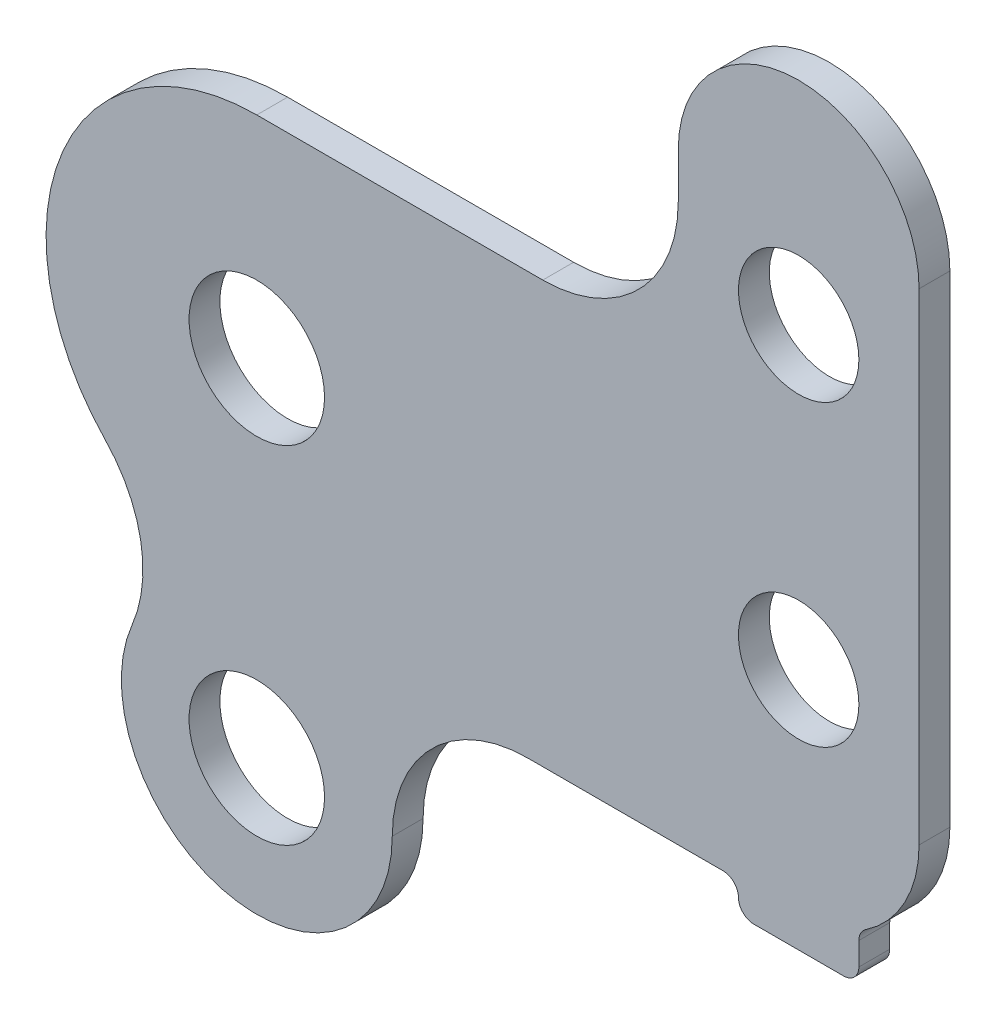
ISO-10303-21;
HEADER;
FILE_DESCRIPTION(('STEP AP214'),'2;1');
FILE_NAME('part.step','',(''),(''),'','','');
FILE_SCHEMA(('AUTOMOTIVE_DESIGN { 1 0 10303 214 1 1 1 1 }'));
ENDSEC;
DATA;
#1=APPLICATION_CONTEXT('core data for automotive mechanical design processes');
#2=APPLICATION_PROTOCOL_DEFINITION('international standard','automotive_design',2000,#1);
#3=PRODUCT_CONTEXT('',#1,'mechanical');
#4=PRODUCT('Part','Part','',(#3));
#5=PRODUCT_RELATED_PRODUCT_CATEGORY('part','',(#4));
#6=PRODUCT_DEFINITION_FORMATION('','',#4);
#7=PRODUCT_DEFINITION_CONTEXT('part definition',#1,'design');
#8=PRODUCT_DEFINITION('design','',#6,#7);
#9=PRODUCT_DEFINITION_SHAPE('','',#8);
#10=(LENGTH_UNIT() NAMED_UNIT(*) SI_UNIT(.MILLI.,.METRE.));
#11=(NAMED_UNIT(*) PLANE_ANGLE_UNIT() SI_UNIT($,.RADIAN.));
#12=(NAMED_UNIT(*) SI_UNIT($,.STERADIAN.) SOLID_ANGLE_UNIT());
#13=UNCERTAINTY_MEASURE_WITH_UNIT(LENGTH_MEASURE(1.E-05),#10,'distance_accuracy_value','');
#14=(GEOMETRIC_REPRESENTATION_CONTEXT(3) GLOBAL_UNCERTAINTY_ASSIGNED_CONTEXT((#13)) GLOBAL_UNIT_ASSIGNED_CONTEXT((#10,
#11,#12)) REPRESENTATION_CONTEXT('',''));
#15=CARTESIAN_POINT('',(0.,0.,0.));
#16=DIRECTION('',(0.,0.,1.));
#17=DIRECTION('',(1.,0.,0.));
#18=AXIS2_PLACEMENT_3D('',#15,#16,#17);
#19=CARTESIAN_POINT('',(0.,-6.36905,0.8128));
#20=DIRECTION('',(0.,1.,0.));
#21=DIRECTION('',(0.,0.,1.));
#22=AXIS2_PLACEMENT_3D('',#19,#20,#21);
#23=PLANE('',#22);
#24=DIRECTION('',(1.,0.,0.));
#25=VECTOR('',#24,1.);
#26=CARTESIAN_POINT('',(0.,-6.36905,0.));
#27=LINE('',#26,#25);
#28=CARTESIAN_POINT('',(13.1063647221787,-6.36905,0.));
#29=VERTEX_POINT('',#28);
#30=CARTESIAN_POINT('',(15.4685647221787,-6.36905,0.));
#31=VERTEX_POINT('',#30);
#32=EDGE_CURVE('E331',#29,#31,#27,.T.);
#33=ORIENTED_EDGE('',*,*,#32,.T.);
#34=DIRECTION('',(0.,0.,-1.));
#35=VECTOR('',#34,1.);
#36=CARTESIAN_POINT('',(15.4685647221787,-6.36905,0.8128));
#37=LINE('',#36,#35);
#38=CARTESIAN_POINT('',(15.4685647221787,-6.36905,0.8128));
#39=VERTEX_POINT('',#38);
#40=EDGE_CURVE('E390',#31,#39,#37,.F.);
#41=ORIENTED_EDGE('',*,*,#40,.T.);
#42=DIRECTION('',(1.,0.,0.));
#43=VECTOR('',#42,1.);
#44=CARTESIAN_POINT('',(0.,-6.36905,0.8128));
#45=LINE('',#44,#43);
#46=CARTESIAN_POINT('',(13.1063647221787,-6.36905,0.8128));
#47=VERTEX_POINT('',#46);
#48=EDGE_CURVE('E273',#47,#39,#45,.T.);
#49=ORIENTED_EDGE('',*,*,#48,.F.);
#50=DIRECTION('',(0.,0.,-1.));
#51=VECTOR('',#50,1.);
#52=CARTESIAN_POINT('',(13.1063647221787,-6.36905,0.8128));
#53=LINE('',#52,#51);
#54=EDGE_CURVE('E387',#47,#29,#53,.T.);
#55=ORIENTED_EDGE('',*,*,#54,.T.);
#56=EDGE_LOOP('',(#33,#41,#49,#55));
#57=FACE_BOUND('',#56,.T.);
#58=ADVANCED_FACE('F92',(#57),#23,.F.);
#59=CARTESIAN_POINT('',(0.,-9.128125,0.8128));
#60=DIRECTION('',(0.,0.,-1.));
#61=DIRECTION('',(-1.,0.,0.));
#62=AXIS2_PLACEMENT_3D('',#59,#60,#61);
#63=CYLINDRICAL_SURFACE('',#62,1.7859375);
#64=CARTESIAN_POINT('',(0.,-9.128125,0.8128));
#65=DIRECTION('',(0.,0.,1.));
#66=DIRECTION('',(1.,0.,0.));
#67=AXIS2_PLACEMENT_3D('',#64,#65,#66);
#68=CIRCLE('',#67,1.7859375);
#69=CARTESIAN_POINT('',(1.7859375,-9.128125,0.8128));
#70=VERTEX_POINT('',#69);
#71=EDGE_CURVE('E288',#70,#70,#68,.T.);
#72=ORIENTED_EDGE('',*,*,#71,.T.);
#73=EDGE_LOOP('',(#72));
#74=FACE_BOUND('',#73,.T.);
#75=CARTESIAN_POINT('',(0.,-9.128125,0.));
#76=DIRECTION('',(0.,0.,1.));
#77=DIRECTION('',(1.,0.,0.));
#78=AXIS2_PLACEMENT_3D('',#75,#76,#77);
#79=CIRCLE('',#78,1.7859375);
#80=CARTESIAN_POINT('',(1.7859375,-9.128125,0.));
#81=VERTEX_POINT('',#80);
#82=EDGE_CURVE('E347',#81,#81,#79,.T.);
#83=ORIENTED_EDGE('',*,*,#82,.F.);
#84=EDGE_LOOP('',(#83));
#85=FACE_BOUND('',#84,.T.);
#86=ADVANCED_FACE('F448',(#74,#85),#63,.F.);
#87=CARTESIAN_POINT('',(0.,0.,0.8128));
#88=DIRECTION('',(0.,0.,-1.));
#89=DIRECTION('',(-1.,0.,0.));
#90=AXIS2_PLACEMENT_3D('',#87,#88,#89);
#91=CYLINDRICAL_SURFACE('',#90,1.7859375);
#92=CARTESIAN_POINT('',(0.,0.,0.8128));
#93=DIRECTION('',(0.,0.,1.));
#94=DIRECTION('',(1.,0.,0.));
#95=AXIS2_PLACEMENT_3D('',#92,#93,#94);
#96=CIRCLE('',#95,1.7859375);
#97=CARTESIAN_POINT('',(1.7859375,0.,0.8128));
#98=VERTEX_POINT('',#97);
#99=EDGE_CURVE('E284',#98,#98,#96,.T.);
#100=ORIENTED_EDGE('',*,*,#99,.T.);
#101=EDGE_LOOP('',(#100));
#102=FACE_BOUND('',#101,.T.);
#103=CARTESIAN_POINT('',(0.,0.,0.));
#104=DIRECTION('',(0.,0.,1.));
#105=DIRECTION('',(1.,0.,0.));
#106=AXIS2_PLACEMENT_3D('',#103,#104,#105);
#107=CIRCLE('',#106,1.7859375);
#108=CARTESIAN_POINT('',(1.7859375,0.,0.));
#109=VERTEX_POINT('',#108);
#110=EDGE_CURVE('E343',#109,#109,#107,.T.);
#111=ORIENTED_EDGE('',*,*,#110,.F.);
#112=EDGE_LOOP('',(#111));
#113=FACE_BOUND('',#112,.T.);
#114=ADVANCED_FACE('F450',(#102,#113),#91,.F.);
#115=CARTESIAN_POINT('',(14.2874647221787,7.90575,0.8128));
#116=DIRECTION('',(0.,0.,-1.));
#117=DIRECTION('',(-1.,0.,0.));
#118=AXIS2_PLACEMENT_3D('',#115,#116,#117);
#119=CYLINDRICAL_SURFACE('',#118,1.58750000000001);
#120=CARTESIAN_POINT('',(14.2874647221787,7.90575,0.8128));
#121=DIRECTION('',(0.,0.,1.));
#122=DIRECTION('',(1.,0.,0.));
#123=AXIS2_PLACEMENT_3D('',#120,#121,#122);
#124=CIRCLE('',#123,1.58750000000001);
#125=CARTESIAN_POINT('',(15.8749647221787,7.90575,0.8128));
#126=VERTEX_POINT('',#125);
#127=EDGE_CURVE('E280',#126,#126,#124,.T.);
#128=ORIENTED_EDGE('',*,*,#127,.T.);
#129=EDGE_LOOP('',(#128));
#130=FACE_BOUND('',#129,.T.);
#131=CARTESIAN_POINT('',(14.2874647221787,7.90575,0.));
#132=DIRECTION('',(0.,0.,1.));
#133=DIRECTION('',(1.,0.,0.));
#134=AXIS2_PLACEMENT_3D('',#131,#132,#133);
#135=CIRCLE('',#134,1.58750000000001);
#136=CARTESIAN_POINT('',(15.8749647221787,7.90575,0.));
#137=VERTEX_POINT('',#136);
#138=EDGE_CURVE('E339',#137,#137,#135,.T.);
#139=ORIENTED_EDGE('',*,*,#138,.F.);
#140=EDGE_LOOP('',(#139));
#141=FACE_BOUND('',#140,.T.);
#142=ADVANCED_FACE('F457',(#130,#141),#119,.F.);
#143=CARTESIAN_POINT('',(14.2874647221787,0.0317500000000005,0.8128));
#144=DIRECTION('',(0.,0.,-1.));
#145=DIRECTION('',(-1.,0.,0.));
#146=AXIS2_PLACEMENT_3D('',#143,#144,#145);
#147=CYLINDRICAL_SURFACE('',#146,1.58750000000001);
#148=CARTESIAN_POINT('',(14.2874647221787,0.0317500000000005,0.8128));
#149=DIRECTION('',(0.,0.,1.));
#150=DIRECTION('',(1.,0.,0.));
#151=AXIS2_PLACEMENT_3D('',#148,#149,#150);
#152=CIRCLE('',#151,1.58750000000001);
#153=CARTESIAN_POINT('',(15.8749647221787,0.0317500000000005,0.8128));
#154=VERTEX_POINT('',#153);
#155=EDGE_CURVE('E276',#154,#154,#152,.T.);
#156=ORIENTED_EDGE('',*,*,#155,.T.);
#157=EDGE_LOOP('',(#156));
#158=FACE_BOUND('',#157,.T.);
#159=CARTESIAN_POINT('',(14.2874647221787,0.0317500000000005,0.));
#160=DIRECTION('',(0.,0.,1.));
#161=DIRECTION('',(1.,0.,0.));
#162=AXIS2_PLACEMENT_3D('',#159,#160,#161);
#163=CIRCLE('',#162,1.58750000000001);
#164=CARTESIAN_POINT('',(15.8749647221787,0.0317500000000005,0.));
#165=VERTEX_POINT('',#164);
#166=EDGE_CURVE('E335',#165,#165,#163,.T.);
#167=ORIENTED_EDGE('',*,*,#166,.F.);
#168=EDGE_LOOP('',(#167));
#169=FACE_BOUND('',#168,.T.);
#170=ADVANCED_FACE('F469',(#158,#169),#147,.F.);
#171=CARTESIAN_POINT('',(14.2874647221787,-2.38125,0.8128));
#172=DIRECTION('',(0.,0.,-1.));
#173=DIRECTION('',(-1.,0.,0.));
#174=AXIS2_PLACEMENT_3D('',#171,#172,#173);
#175=CYLINDRICAL_SURFACE('',#174,3.17500000000001);
#176=CARTESIAN_POINT('',(14.2874647221787,-2.38125,0.8128));
#177=DIRECTION('',(0.,0.,1.));
#178=DIRECTION('',(1.,0.,0.));
#179=AXIS2_PLACEMENT_3D('',#176,#177,#178);
#180=CIRCLE('',#179,3.17500000000001);
#181=CARTESIAN_POINT('',(16.0551065661503,-5.01868574546199,0.8128));
#182=VERTEX_POINT('',#181);
#183=CARTESIAN_POINT('',(17.4624647221787,-2.38125,0.8128));
#184=VERTEX_POINT('',#183);
#185=EDGE_CURVE('E212',#182,#184,#180,.T.);
#186=ORIENTED_EDGE('',*,*,#185,.F.);
#187=DIRECTION('',(0.,0.,-1.));
#188=VECTOR('',#187,1.);
#189=CARTESIAN_POINT('',(16.0551065661503,-5.01868574546199,0.8128));
#190=LINE('',#189,#188);
#191=CARTESIAN_POINT('',(16.0551065661503,-5.01868574546199,0.));
#192=VERTEX_POINT('',#191);
#193=EDGE_CURVE('E237',#182,#192,#190,.T.);
#194=ORIENTED_EDGE('',*,*,#193,.T.);
#195=CARTESIAN_POINT('',(14.2874647221787,-2.38125,0.));
#196=DIRECTION('',(0.,0.,1.));
#197=DIRECTION('',(1.,0.,0.));
#198=AXIS2_PLACEMENT_3D('',#195,#196,#197);
#199=CIRCLE('',#198,3.17500000000001);
#200=CARTESIAN_POINT('',(17.4624647221787,-2.38125,0.));
#201=VERTEX_POINT('',#200);
#202=EDGE_CURVE('E232',#192,#201,#199,.T.);
#203=ORIENTED_EDGE('',*,*,#202,.T.);
#204=DIRECTION('',(0.,0.,-1.));
#205=VECTOR('',#204,1.);
#206=CARTESIAN_POINT('',(17.4624647221787,-2.38125,0.8128));
#207=LINE('',#206,#205);
#208=EDGE_CURVE('E229',#184,#201,#207,.T.);
#209=ORIENTED_EDGE('',*,*,#208,.F.);
#210=EDGE_LOOP('',(#186,#194,#203,#209));
#211=FACE_BOUND('',#210,.T.);
#212=ADVANCED_FACE('F230',(#211),#175,.T.);
#213=CARTESIAN_POINT('',(17.4624647221787,0.,0.8128));
#214=DIRECTION('',(1.,0.,0.));
#215=DIRECTION('',(0.,0.,-1.));
#216=AXIS2_PLACEMENT_3D('',#213,#214,#215);
#217=PLANE('',#216);
#218=DIRECTION('',(0.,-1.,0.));
#219=VECTOR('',#218,1.);
#220=CARTESIAN_POINT('',(17.4624647221787,0.,0.));
#221=LINE('',#220,#219);
#222=CARTESIAN_POINT('',(17.4624647221787,10.31875,0.));
#223=VERTEX_POINT('',#222);
#224=EDGE_CURVE('E300',#223,#201,#221,.T.);
#225=ORIENTED_EDGE('',*,*,#224,.F.);
#226=DIRECTION('',(0.,0.,-1.));
#227=VECTOR('',#226,1.);
#228=CARTESIAN_POINT('',(17.4624647221787,10.31875,0.8128));
#229=LINE('',#228,#227);
#230=CARTESIAN_POINT('',(17.4624647221787,10.31875,0.8128));
#231=VERTEX_POINT('',#230);
#232=EDGE_CURVE('E238',#231,#223,#229,.T.);
#233=ORIENTED_EDGE('',*,*,#232,.F.);
#234=DIRECTION('',(0.,-1.,0.));
#235=VECTOR('',#234,1.);
#236=CARTESIAN_POINT('',(17.4624647221787,0.,0.8128));
#237=LINE('',#236,#235);
#238=EDGE_CURVE('E218',#231,#184,#237,.T.);
#239=ORIENTED_EDGE('',*,*,#238,.T.);
#240=ORIENTED_EDGE('',*,*,#208,.T.);
#241=EDGE_LOOP('',(#225,#233,#239,#240));
#242=FACE_BOUND('',#241,.T.);
#243=ADVANCED_FACE('F240',(#242),#217,.T.);
#244=CARTESIAN_POINT('',(14.2874647221787,10.31875,0.8128));
#245=DIRECTION('',(0.,0.,-1.));
#246=DIRECTION('',(-1.,0.,0.));
#247=AXIS2_PLACEMENT_3D('',#244,#245,#246);
#248=CYLINDRICAL_SURFACE('',#247,3.17500000000001);
#249=CARTESIAN_POINT('',(14.2874647221787,10.31875,0.));
#250=DIRECTION('',(0.,0.,1.));
#251=DIRECTION('',(1.,0.,0.));
#252=AXIS2_PLACEMENT_3D('',#249,#250,#251);
#253=CIRCLE('',#252,3.17500000000001);
#254=CARTESIAN_POINT('',(11.1124647221787,10.31875,0.));
#255=VERTEX_POINT('',#254);
#256=EDGE_CURVE('E303',#223,#255,#253,.T.);
#257=ORIENTED_EDGE('',*,*,#256,.T.);
#258=DIRECTION('',(0.,0.,-1.));
#259=VECTOR('',#258,1.);
#260=CARTESIAN_POINT('',(11.1124647221787,10.31875,0.8128));
#261=LINE('',#260,#259);
#262=CARTESIAN_POINT('',(11.1124647221787,10.31875,0.8128));
#263=VERTEX_POINT('',#262);
#264=EDGE_CURVE('E366',#263,#255,#261,.T.);
#265=ORIENTED_EDGE('',*,*,#264,.F.);
#266=CARTESIAN_POINT('',(14.2874647221787,10.31875,0.8128));
#267=DIRECTION('',(0.,0.,1.));
#268=DIRECTION('',(1.,0.,0.));
#269=AXIS2_PLACEMENT_3D('',#266,#267,#268);
#270=CIRCLE('',#269,3.17500000000001);
#271=EDGE_CURVE('E243',#231,#263,#270,.T.);
#272=ORIENTED_EDGE('',*,*,#271,.F.);
#273=ORIENTED_EDGE('',*,*,#232,.T.);
#274=EDGE_LOOP('',(#257,#265,#272,#273));
#275=FACE_BOUND('',#274,.T.);
#276=ADVANCED_FACE('F498',(#275),#248,.T.);
#277=CARTESIAN_POINT('',(11.1124647221787,0.,0.8128));
#278=DIRECTION('',(1.,0.,0.));
#279=DIRECTION('',(0.,1.,0.));
#280=AXIS2_PLACEMENT_3D('',#277,#278,#279);
#281=PLANE('',#280);
#282=DIRECTION('',(0.,-1.,0.));
#283=VECTOR('',#282,1.);
#284=CARTESIAN_POINT('',(11.1124647221787,0.,0.));
#285=LINE('',#284,#283);
#286=CARTESIAN_POINT('',(11.1124647221787,9.128125,0.));
#287=VERTEX_POINT('',#286);
#288=EDGE_CURVE('E306',#255,#287,#285,.T.);
#289=ORIENTED_EDGE('',*,*,#288,.T.);
#290=DIRECTION('',(0.,0.,-1.));
#291=VECTOR('',#290,1.);
#292=CARTESIAN_POINT('',(11.1124647221787,9.128125,0.8128));
#293=LINE('',#292,#291);
#294=CARTESIAN_POINT('',(11.1124647221787,9.128125,0.8128));
#295=VERTEX_POINT('',#294);
#296=EDGE_CURVE('E108',#287,#295,#293,.F.);
#297=ORIENTED_EDGE('',*,*,#296,.T.);
#298=DIRECTION('',(0.,-1.,0.));
#299=VECTOR('',#298,1.);
#300=CARTESIAN_POINT('',(11.1124647221787,0.,0.8128));
#301=LINE('',#300,#299);
#302=EDGE_CURVE('E246',#263,#295,#301,.T.);
#303=ORIENTED_EDGE('',*,*,#302,.F.);
#304=ORIENTED_EDGE('',*,*,#264,.T.);
#305=EDGE_LOOP('',(#289,#297,#303,#304));
#306=FACE_BOUND('',#305,.T.);
#307=ADVANCED_FACE('F495',(#306),#281,.F.);
#308=CARTESIAN_POINT('',(0.,5.55625,0.8128));
#309=DIRECTION('',(0.,1.,0.));
#310=DIRECTION('',(-1.,0.,0.));
#311=AXIS2_PLACEMENT_3D('',#308,#309,#310);
#312=PLANE('',#311);
#313=DIRECTION('',(1.,0.,0.));
#314=VECTOR('',#313,1.);
#315=CARTESIAN_POINT('',(0.,5.55625,0.8128));
#316=LINE('',#315,#314);
#317=CARTESIAN_POINT('',(0.,5.55625,0.8128));
#318=VERTEX_POINT('',#317);
#319=CARTESIAN_POINT('',(7.54058972217867,5.55625,0.8128));
#320=VERTEX_POINT('',#319);
#321=EDGE_CURVE('E252',#318,#320,#316,.T.);
#322=ORIENTED_EDGE('',*,*,#321,.T.);
#323=DIRECTION('',(0.,0.,-1.));
#324=VECTOR('',#323,1.);
#325=CARTESIAN_POINT('',(7.54058972217867,5.55625,0.8128));
#326=LINE('',#325,#324);
#327=CARTESIAN_POINT('',(7.54058972217867,5.55625,0.));
#328=VERTEX_POINT('',#327);
#329=EDGE_CURVE('E414',#320,#328,#326,.T.);
#330=ORIENTED_EDGE('',*,*,#329,.T.);
#331=DIRECTION('',(1.,0.,0.));
#332=VECTOR('',#331,1.);
#333=CARTESIAN_POINT('',(0.,5.55625,0.));
#334=LINE('',#333,#332);
#335=CARTESIAN_POINT('',(0.,5.55625,0.));
#336=VERTEX_POINT('',#335);
#337=EDGE_CURVE('E309',#336,#328,#334,.T.);
#338=ORIENTED_EDGE('',*,*,#337,.F.);
#339=DIRECTION('',(0.,0.,-1.));
#340=VECTOR('',#339,1.);
#341=CARTESIAN_POINT('',(0.,5.55625,0.8128));
#342=LINE('',#341,#340);
#343=EDGE_CURVE('E363',#318,#336,#342,.T.);
#344=ORIENTED_EDGE('',*,*,#343,.F.);
#345=EDGE_LOOP('',(#322,#330,#338,#344));
#346=FACE_BOUND('',#345,.T.);
#347=ADVANCED_FACE('F426',(#346),#312,.T.);
#348=CARTESIAN_POINT('',(0.,0.,0.8128));
#349=DIRECTION('',(0.,0.,-1.));
#350=DIRECTION('',(-1.,0.,0.));
#351=AXIS2_PLACEMENT_3D('',#348,#349,#350);
#352=CYLINDRICAL_SURFACE('',#351,5.55625);
#353=CARTESIAN_POINT('',(0.,0.,0.));
#354=DIRECTION('',(0.,0.,1.));
#355=DIRECTION('',(1.,0.,0.));
#356=AXIS2_PLACEMENT_3D('',#353,#354,#355);
#357=CIRCLE('',#356,5.55625);
#358=CARTESIAN_POINT('',(-4.0016363402321,-3.8547140831758,0.));
#359=VERTEX_POINT('',#358);
#360=EDGE_CURVE('E312',#336,#359,#357,.T.);
#361=ORIENTED_EDGE('',*,*,#360,.T.);
#362=DIRECTION('',(0.,0.,-1.));
#363=VECTOR('',#362,1.);
#364=CARTESIAN_POINT('',(-4.0016363402321,-3.8547140831758,0.8128));
#365=LINE('',#364,#363);
#366=CARTESIAN_POINT('',(-4.0016363402321,-3.8547140831758,0.8128));
#367=VERTEX_POINT('',#366);
#368=EDGE_CURVE('E360',#367,#359,#365,.T.);
#369=ORIENTED_EDGE('',*,*,#368,.F.);
#370=CARTESIAN_POINT('',(0.,0.,0.8128));
#371=DIRECTION('',(0.,0.,1.));
#372=DIRECTION('',(1.,0.,0.));
#373=AXIS2_PLACEMENT_3D('',#370,#371,#372);
#374=CIRCLE('',#373,5.55625);
#375=EDGE_CURVE('E256',#318,#367,#374,.T.);
#376=ORIENTED_EDGE('',*,*,#375,.F.);
#377=ORIENTED_EDGE('',*,*,#343,.T.);
#378=EDGE_LOOP('',(#361,#369,#376,#377));
#379=FACE_BOUND('',#378,.T.);
#380=ADVANCED_FACE('F437',(#379),#352,.T.);
#381=CARTESIAN_POINT('',(-6.57411684466701,-6.33274456521739,0.8128));
#382=DIRECTION('',(0.,0.,-1.));
#383=DIRECTION('',(-1.,0.,0.));
#384=AXIS2_PLACEMENT_3D('',#381,#382,#383);
#385=CYLINDRICAL_SURFACE('',#384,3.571875);
#386=CARTESIAN_POINT('',(-6.57411684466701,-6.33274456521739,0.));
#387=DIRECTION('',(0.,0.,1.));
#388=DIRECTION('',(1.,0.,0.));
#389=AXIS2_PLACEMENT_3D('',#386,#387,#388);
#390=CIRCLE('',#389,3.571875);
#391=CARTESIAN_POINT('',(-3.28705842233351,-7.73043478260869,0.));
#392=VERTEX_POINT('',#391);
#393=EDGE_CURVE('E316',#392,#359,#390,.T.);
#394=ORIENTED_EDGE('',*,*,#393,.F.);
#395=DIRECTION('',(0.,0.,-1.));
#396=VECTOR('',#395,1.);
#397=CARTESIAN_POINT('',(-3.28705842233351,-7.73043478260869,0.8128));
#398=LINE('',#397,#396);
#399=CARTESIAN_POINT('',(-3.28705842233351,-7.73043478260869,0.8128));
#400=VERTEX_POINT('',#399);
#401=EDGE_CURVE('E357',#400,#392,#398,.T.);
#402=ORIENTED_EDGE('',*,*,#401,.F.);
#403=CARTESIAN_POINT('',(-6.57411684466701,-6.33274456521739,0.8128));
#404=DIRECTION('',(0.,0.,1.));
#405=DIRECTION('',(1.,0.,0.));
#406=AXIS2_PLACEMENT_3D('',#403,#404,#405);
#407=CIRCLE('',#406,3.571875);
#408=EDGE_CURVE('E259',#400,#367,#407,.T.);
#409=ORIENTED_EDGE('',*,*,#408,.T.);
#410=ORIENTED_EDGE('',*,*,#368,.T.);
#411=EDGE_LOOP('',(#394,#402,#409,#410));
#412=FACE_BOUND('',#411,.T.);
#413=ADVANCED_FACE('F486',(#412),#385,.F.);
#414=CARTESIAN_POINT('',(0.,-9.128125,0.8128));
#415=DIRECTION('',(0.,0.,-1.));
#416=DIRECTION('',(-1.,0.,0.));
#417=AXIS2_PLACEMENT_3D('',#414,#415,#416);
#418=CYLINDRICAL_SURFACE('',#417,3.571875);
#419=CARTESIAN_POINT('',(0.,-9.128125,0.));
#420=DIRECTION('',(0.,0.,1.));
#421=DIRECTION('',(1.,0.,0.));
#422=AXIS2_PLACEMENT_3D('',#419,#420,#421);
#423=CIRCLE('',#422,3.571875);
#424=CARTESIAN_POINT('',(3.571875,-9.128125,0.));
#425=VERTEX_POINT('',#424);
#426=EDGE_CURVE('E320',#392,#425,#423,.T.);
#427=ORIENTED_EDGE('',*,*,#426,.T.);
#428=DIRECTION('',(0.,0.,-1.));
#429=VECTOR('',#428,1.);
#430=CARTESIAN_POINT('',(3.571875,-9.128125,0.8128));
#431=LINE('',#430,#429);
#432=CARTESIAN_POINT('',(3.571875,-9.128125,0.8128));
#433=VERTEX_POINT('',#432);
#434=EDGE_CURVE('E354',#433,#425,#431,.T.);
#435=ORIENTED_EDGE('',*,*,#434,.F.);
#436=CARTESIAN_POINT('',(0.,-9.128125,0.8128));
#437=DIRECTION('',(0.,0.,1.));
#438=DIRECTION('',(1.,0.,0.));
#439=AXIS2_PLACEMENT_3D('',#436,#437,#438);
#440=CIRCLE('',#439,3.571875);
#441=EDGE_CURVE('E263',#400,#433,#440,.T.);
#442=ORIENTED_EDGE('',*,*,#441,.F.);
#443=ORIENTED_EDGE('',*,*,#401,.T.);
#444=EDGE_LOOP('',(#427,#435,#442,#443));
#445=FACE_BOUND('',#444,.T.);
#446=ADVANCED_FACE('F482',(#445),#418,.T.);
#447=CARTESIAN_POINT('',(7.14375,-9.128125,0.8128));
#448=DIRECTION('',(0.,0.,-1.));
#449=DIRECTION('',(-1.,0.,0.));
#450=AXIS2_PLACEMENT_3D('',#447,#448,#449);
#451=CYLINDRICAL_SURFACE('',#450,3.571875);
#452=CARTESIAN_POINT('',(7.14375,-9.128125,0.));
#453=DIRECTION('',(0.,0.,1.));
#454=DIRECTION('',(1.,0.,0.));
#455=AXIS2_PLACEMENT_3D('',#452,#453,#454);
#456=CIRCLE('',#455,3.571875);
#457=CARTESIAN_POINT('',(7.14375,-5.55625,0.));
#458=VERTEX_POINT('',#457);
#459=EDGE_CURVE('E324',#458,#425,#456,.T.);
#460=ORIENTED_EDGE('',*,*,#459,.F.);
#461=DIRECTION('',(0.,0.,-1.));
#462=VECTOR('',#461,1.);
#463=CARTESIAN_POINT('',(7.14375,-5.55625,0.8128));
#464=LINE('',#463,#462);
#465=CARTESIAN_POINT('',(7.14375,-5.55625,0.8128));
#466=VERTEX_POINT('',#465);
#467=EDGE_CURVE('E292',#466,#458,#464,.T.);
#468=ORIENTED_EDGE('',*,*,#467,.F.);
#469=CARTESIAN_POINT('',(7.14375,-9.128125,0.8128));
#470=DIRECTION('',(0.,0.,1.));
#471=DIRECTION('',(1.,0.,0.));
#472=AXIS2_PLACEMENT_3D('',#469,#470,#471);
#473=CIRCLE('',#472,3.571875);
#474=EDGE_CURVE('E266',#466,#433,#473,.T.);
#475=ORIENTED_EDGE('',*,*,#474,.T.);
#476=ORIENTED_EDGE('',*,*,#434,.T.);
#477=EDGE_LOOP('',(#460,#468,#475,#476));
#478=FACE_BOUND('',#477,.T.);
#479=ADVANCED_FACE('F478',(#478),#451,.F.);
#480=CARTESIAN_POINT('',(0.,-5.55625,0.8128));
#481=DIRECTION('',(0.,-1.,0.));
#482=DIRECTION('',(0.,0.,-1.));
#483=AXIS2_PLACEMENT_3D('',#480,#481,#482);
#484=PLANE('',#483);
#485=DIRECTION('',(-1.,0.,0.));
#486=VECTOR('',#485,1.);
#487=CARTESIAN_POINT('',(0.,-5.55625,0.));
#488=LINE('',#487,#486);
#489=CARTESIAN_POINT('',(12.2935647221787,-5.55625,0.));
#490=VERTEX_POINT('',#489);
#491=EDGE_CURVE('E328',#490,#458,#488,.T.);
#492=ORIENTED_EDGE('',*,*,#491,.F.);
#493=DIRECTION('',(0.,0.,-1.));
#494=VECTOR('',#493,1.);
#495=CARTESIAN_POINT('',(12.2935647221787,-5.55625,0.8128));
#496=LINE('',#495,#494);
#497=CARTESIAN_POINT('',(12.2935647221787,-5.55625,0.8128));
#498=VERTEX_POINT('',#497);
#499=EDGE_CURVE('E399',#490,#498,#496,.F.);
#500=ORIENTED_EDGE('',*,*,#499,.T.);
#501=DIRECTION('',(-1.,0.,0.));
#502=VECTOR('',#501,1.);
#503=CARTESIAN_POINT('',(0.,-5.55625,0.8128));
#504=LINE('',#503,#502);
#505=EDGE_CURVE('E270',#498,#466,#504,.T.);
#506=ORIENTED_EDGE('',*,*,#505,.T.);
#507=ORIENTED_EDGE('',*,*,#467,.T.);
#508=EDGE_LOOP('',(#492,#500,#506,#507));
#509=FACE_BOUND('',#508,.T.);
#510=ADVANCED_FACE('F474',(#509),#484,.T.);
#511=CARTESIAN_POINT('',(15.8749647221786,0.,0.8128));
#512=DIRECTION('',(1.,0.,0.));
#513=DIRECTION('',(0.,1.,0.));
#514=AXIS2_PLACEMENT_3D('',#511,#512,#513);
#515=PLANE('',#514);
#516=DIRECTION('',(0.,-1.,0.));
#517=VECTOR('',#516,1.);
#518=CARTESIAN_POINT('',(15.8749647221786,0.,0.));
#519=LINE('',#518,#517);
#520=CARTESIAN_POINT('',(15.8749647221787,-5.35627752088112,0.));
#521=VERTEX_POINT('',#520);
#522=CARTESIAN_POINT('',(15.8749647221787,-5.96265,0.));
#523=VERTEX_POINT('',#522);
#524=EDGE_CURVE('E293',#521,#523,#519,.T.);
#525=ORIENTED_EDGE('',*,*,#524,.F.);
#526=DIRECTION('',(0.,0.,-1.));
#527=VECTOR('',#526,1.);
#528=CARTESIAN_POINT('',(15.8749647221787,-5.35627752088112,0.8128));
#529=LINE('',#528,#527);
#530=CARTESIAN_POINT('',(15.8749647221787,-5.35627752088112,0.8128));
#531=VERTEX_POINT('',#530);
#532=EDGE_CURVE('E378',#521,#531,#529,.F.);
#533=ORIENTED_EDGE('',*,*,#532,.T.);
#534=DIRECTION('',(0.,-1.,0.));
#535=VECTOR('',#534,1.);
#536=CARTESIAN_POINT('',(15.8749647221786,0.,0.8128));
#537=LINE('',#536,#535);
#538=CARTESIAN_POINT('',(15.8749647221787,-5.96265,0.8128));
#539=VERTEX_POINT('',#538);
#540=EDGE_CURVE('E226',#531,#539,#537,.T.);
#541=ORIENTED_EDGE('',*,*,#540,.T.);
#542=DIRECTION('',(0.,0.,-1.));
#543=VECTOR('',#542,1.);
#544=CARTESIAN_POINT('',(15.8749647221787,-5.96265,0.));
#545=LINE('',#544,#543);
#546=EDGE_CURVE('E374',#539,#523,#545,.T.);
#547=ORIENTED_EDGE('',*,*,#546,.T.);
#548=EDGE_LOOP('',(#525,#533,#541,#547));
#549=FACE_BOUND('',#548,.T.);
#550=ADVANCED_FACE('F477',(#549),#515,.T.);
#551=CARTESIAN_POINT('',(0.,0.,0.));
#552=DIRECTION('',(0.,0.,1.));
#553=DIRECTION('',(1.,0.,0.));
#554=AXIS2_PLACEMENT_3D('',#551,#552,#553);
#555=PLANE('',#554);
#556=ORIENTED_EDGE('',*,*,#524,.T.);
#557=CARTESIAN_POINT('',(15.4685647221787,-5.96265,0.));
#558=DIRECTION('',(0.,0.,1.));
#559=DIRECTION('',(1.,0.,0.));
#560=AXIS2_PLACEMENT_3D('',#557,#558,#559);
#561=CIRCLE('',#560,0.4064);
#562=EDGE_CURVE('E384',#523,#31,#561,.F.);
#563=ORIENTED_EDGE('',*,*,#562,.T.);
#564=ORIENTED_EDGE('',*,*,#32,.F.);
#565=CARTESIAN_POINT('',(13.1063647221787,-5.96265,0.));
#566=DIRECTION('',(0.,0.,1.));
#567=DIRECTION('',(1.,0.,0.));
#568=AXIS2_PLACEMENT_3D('',#565,#566,#567);
#569=CIRCLE('',#568,0.4064);
#570=CARTESIAN_POINT('',(12.6999647221787,-5.96265,0.));
#571=VERTEX_POINT('',#570);
#572=EDGE_CURVE('E381',#29,#571,#569,.F.);
#573=ORIENTED_EDGE('',*,*,#572,.T.);
#574=CARTESIAN_POINT('',(12.2935647221787,-5.96265,0.));
#575=DIRECTION('',(0.,0.,1.));
#576=DIRECTION('',(1.,0.,0.));
#577=AXIS2_PLACEMENT_3D('',#574,#575,#576);
#578=CIRCLE('',#577,0.4064);
#579=EDGE_CURVE('E408',#571,#490,#578,.T.);
#580=ORIENTED_EDGE('',*,*,#579,.T.);
#581=ORIENTED_EDGE('',*,*,#491,.T.);
#582=ORIENTED_EDGE('',*,*,#459,.T.);
#583=ORIENTED_EDGE('',*,*,#426,.F.);
#584=ORIENTED_EDGE('',*,*,#393,.T.);
#585=ORIENTED_EDGE('',*,*,#360,.F.);
#586=ORIENTED_EDGE('',*,*,#337,.T.);
#587=CARTESIAN_POINT('',(7.54058972217867,9.128125,0.));
#588=DIRECTION('',(0.,0.,1.));
#589=DIRECTION('',(1.,0.,0.));
#590=AXIS2_PLACEMENT_3D('',#587,#588,#589);
#591=CIRCLE('',#590,3.571875);
#592=EDGE_CURVE('E101',#328,#287,#591,.T.);
#593=ORIENTED_EDGE('',*,*,#592,.T.);
#594=ORIENTED_EDGE('',*,*,#288,.F.);
#595=ORIENTED_EDGE('',*,*,#256,.F.);
#596=ORIENTED_EDGE('',*,*,#224,.T.);
#597=ORIENTED_EDGE('',*,*,#202,.F.);
#598=CARTESIAN_POINT('',(16.2813647221787,-5.35627752088112,0.));
#599=DIRECTION('',(0.,0.,1.));
#600=DIRECTION('',(1.,0.,0.));
#601=AXIS2_PLACEMENT_3D('',#598,#599,#600);
#602=CIRCLE('',#601,0.4064);
#603=EDGE_CURVE('E403',#192,#521,#602,.T.);
#604=ORIENTED_EDGE('',*,*,#603,.T.);
#605=EDGE_LOOP('',(#556,#563,#564,#573,#580,#581,#582,#583,#584,#585,#586,#593,#594,#595,#596,
#597,#604));
#606=FACE_BOUND('',#605,.T.);
#607=ORIENTED_EDGE('',*,*,#166,.T.);
#608=EDGE_LOOP('',(#607));
#609=FACE_BOUND('',#608,.T.);
#610=ORIENTED_EDGE('',*,*,#138,.T.);
#611=EDGE_LOOP('',(#610));
#612=FACE_BOUND('',#611,.T.);
#613=ORIENTED_EDGE('',*,*,#110,.T.);
#614=EDGE_LOOP('',(#613));
#615=FACE_BOUND('',#614,.T.);
#616=ORIENTED_EDGE('',*,*,#82,.T.);
#617=EDGE_LOOP('',(#616));
#618=FACE_BOUND('',#617,.T.);
#619=ADVANCED_FACE('F431',(#606,#609,#612,#615,#618),#555,.F.);
#620=CARTESIAN_POINT('',(0.,0.,0.8128));
#621=DIRECTION('',(0.,0.,1.));
#622=DIRECTION('',(1.,0.,0.));
#623=AXIS2_PLACEMENT_3D('',#620,#621,#622);
#624=PLANE('',#623);
#625=ORIENTED_EDGE('',*,*,#48,.T.);
#626=CARTESIAN_POINT('',(15.4685647221787,-5.96265,0.8128));
#627=DIRECTION('',(0.,0.,1.));
#628=DIRECTION('',(1.,0.,0.));
#629=AXIS2_PLACEMENT_3D('',#626,#627,#628);
#630=CIRCLE('',#629,0.4064);
#631=EDGE_CURVE('E396',#39,#539,#630,.T.);
#632=ORIENTED_EDGE('',*,*,#631,.T.);
#633=ORIENTED_EDGE('',*,*,#540,.F.);
#634=CARTESIAN_POINT('',(16.2813647221787,-5.35627752088112,0.8128));
#635=DIRECTION('',(0.,0.,1.));
#636=DIRECTION('',(1.,0.,0.));
#637=AXIS2_PLACEMENT_3D('',#634,#635,#636);
#638=CIRCLE('',#637,0.4064);
#639=EDGE_CURVE('E221',#531,#182,#638,.F.);
#640=ORIENTED_EDGE('',*,*,#639,.T.);
#641=ORIENTED_EDGE('',*,*,#185,.T.);
#642=ORIENTED_EDGE('',*,*,#238,.F.);
#643=ORIENTED_EDGE('',*,*,#271,.T.);
#644=ORIENTED_EDGE('',*,*,#302,.T.);
#645=CARTESIAN_POINT('',(7.54058972217867,9.128125,0.8128));
#646=DIRECTION('',(0.,0.,1.));
#647=DIRECTION('',(1.,0.,0.));
#648=AXIS2_PLACEMENT_3D('',#645,#646,#647);
#649=CIRCLE('',#648,3.571875);
#650=EDGE_CURVE('E12',#295,#320,#649,.F.);
#651=ORIENTED_EDGE('',*,*,#650,.T.);
#652=ORIENTED_EDGE('',*,*,#321,.F.);
#653=ORIENTED_EDGE('',*,*,#375,.T.);
#654=ORIENTED_EDGE('',*,*,#408,.F.);
#655=ORIENTED_EDGE('',*,*,#441,.T.);
#656=ORIENTED_EDGE('',*,*,#474,.F.);
#657=ORIENTED_EDGE('',*,*,#505,.F.);
#658=CARTESIAN_POINT('',(12.2935647221787,-5.96265,0.8128));
#659=DIRECTION('',(0.,0.,1.));
#660=DIRECTION('',(1.,0.,0.));
#661=AXIS2_PLACEMENT_3D('',#658,#659,#660);
#662=CIRCLE('',#661,0.4064);
#663=CARTESIAN_POINT('',(12.6999647221787,-5.96265,0.8128));
#664=VERTEX_POINT('',#663);
#665=EDGE_CURVE('E411',#498,#664,#662,.F.);
#666=ORIENTED_EDGE('',*,*,#665,.T.);
#667=CARTESIAN_POINT('',(13.1063647221787,-5.96265,0.8128));
#668=DIRECTION('',(0.,0.,1.));
#669=DIRECTION('',(1.,0.,0.));
#670=AXIS2_PLACEMENT_3D('',#667,#668,#669);
#671=CIRCLE('',#670,0.4064);
#672=EDGE_CURVE('E393',#664,#47,#671,.T.);
#673=ORIENTED_EDGE('',*,*,#672,.T.);
#674=EDGE_LOOP('',(#625,#632,#633,#640,#641,#642,#643,#644,#651,#652,#653,#654,#655,#656,#657,
#666,#673));
#675=FACE_BOUND('',#674,.T.);
#676=ORIENTED_EDGE('',*,*,#155,.F.);
#677=EDGE_LOOP('',(#676));
#678=FACE_BOUND('',#677,.T.);
#679=ORIENTED_EDGE('',*,*,#127,.F.);
#680=EDGE_LOOP('',(#679));
#681=FACE_BOUND('',#680,.T.);
#682=ORIENTED_EDGE('',*,*,#99,.F.);
#683=EDGE_LOOP('',(#682));
#684=FACE_BOUND('',#683,.T.);
#685=ORIENTED_EDGE('',*,*,#71,.F.);
#686=EDGE_LOOP('',(#685));
#687=FACE_BOUND('',#686,.T.);
#688=ADVANCED_FACE('F215',(#675,#678,#681,#684,#687),#624,.T.);
#689=CARTESIAN_POINT('',(16.2813647221787,-5.35627752088112,0.8128));
#690=DIRECTION('',(0.,0.,-1.));
#691=DIRECTION('',(-1.,0.,0.));
#692=AXIS2_PLACEMENT_3D('',#689,#690,#691);
#693=CYLINDRICAL_SURFACE('',#692,0.4064);
#694=ORIENTED_EDGE('',*,*,#639,.F.);
#695=ORIENTED_EDGE('',*,*,#532,.F.);
#696=ORIENTED_EDGE('',*,*,#603,.F.);
#697=ORIENTED_EDGE('',*,*,#193,.F.);
#698=EDGE_LOOP('',(#694,#695,#696,#697));
#699=FACE_BOUND('',#698,.T.);
#700=ADVANCED_FACE('F462',(#699),#693,.F.);
#701=CARTESIAN_POINT('',(15.4685647221787,-5.96265,0.8128));
#702=DIRECTION('',(0.,0.,1.));
#703=DIRECTION('',(1.,0.,0.));
#704=AXIS2_PLACEMENT_3D('',#701,#702,#703);
#705=CYLINDRICAL_SURFACE('',#704,0.4064);
#706=ORIENTED_EDGE('',*,*,#631,.F.);
#707=ORIENTED_EDGE('',*,*,#40,.F.);
#708=ORIENTED_EDGE('',*,*,#562,.F.);
#709=ORIENTED_EDGE('',*,*,#546,.F.);
#710=EDGE_LOOP('',(#706,#707,#708,#709));
#711=FACE_BOUND('',#710,.T.);
#712=ADVANCED_FACE('F511',(#711),#705,.T.);
#713=CARTESIAN_POINT('',(13.1063647221787,-5.96265,0.8128));
#714=DIRECTION('',(0.,0.,-1.));
#715=DIRECTION('',(-1.,0.,0.));
#716=AXIS2_PLACEMENT_3D('',#713,#714,#715);
#717=CYLINDRICAL_SURFACE('',#716,0.4064);
#718=ORIENTED_EDGE('',*,*,#54,.F.);
#719=ORIENTED_EDGE('',*,*,#672,.F.);
#720=DIRECTION('',(0.,0.,-1.));
#721=VECTOR('',#720,1.);
#722=CARTESIAN_POINT('',(12.6999647221787,-5.96265,0.8128));
#723=LINE('',#722,#721);
#724=EDGE_CURVE('E297',#571,#664,#723,.F.);
#725=ORIENTED_EDGE('',*,*,#724,.F.);
#726=ORIENTED_EDGE('',*,*,#572,.F.);
#727=EDGE_LOOP('',(#718,#719,#725,#726));
#728=FACE_BOUND('',#727,.T.);
#729=ADVANCED_FACE('F445',(#728),#717,.T.);
#730=CARTESIAN_POINT('',(12.2935647221787,-5.96265,0.8128));
#731=DIRECTION('',(0.,0.,-1.));
#732=DIRECTION('',(-1.,0.,0.));
#733=AXIS2_PLACEMENT_3D('',#730,#731,#732);
#734=CYLINDRICAL_SURFACE('',#733,0.4064);
#735=ORIENTED_EDGE('',*,*,#665,.F.);
#736=ORIENTED_EDGE('',*,*,#499,.F.);
#737=ORIENTED_EDGE('',*,*,#579,.F.);
#738=ORIENTED_EDGE('',*,*,#724,.T.);
#739=EDGE_LOOP('',(#735,#736,#737,#738));
#740=FACE_BOUND('',#739,.T.);
#741=ADVANCED_FACE('F441',(#740),#734,.F.);
#742=CARTESIAN_POINT('',(7.54058972217867,9.128125,0.8128));
#743=DIRECTION('',(0.,0.,-1.));
#744=DIRECTION('',(-1.,0.,0.));
#745=AXIS2_PLACEMENT_3D('',#742,#743,#744);
#746=CYLINDRICAL_SURFACE('',#745,3.571875);
#747=ORIENTED_EDGE('',*,*,#650,.F.);
#748=ORIENTED_EDGE('',*,*,#296,.F.);
#749=ORIENTED_EDGE('',*,*,#592,.F.);
#750=ORIENTED_EDGE('',*,*,#329,.F.);
#751=EDGE_LOOP('',(#747,#748,#749,#750));
#752=FACE_BOUND('',#751,.T.);
#753=ADVANCED_FACE('F94',(#752),#746,.F.);
#754=CLOSED_SHELL('',(#58,#86,#114,#142,#170,#212,#243,#276,#307,#347,#380,#413,#446,#479,#510,
#550,#619,#688,#700,#712,#729,#741,#753));
#755=MANIFOLD_SOLID_BREP('B2',#754);
#756=ADVANCED_BREP_SHAPE_REPRESENTATION('',(#18,#755),#14);
#757=SHAPE_DEFINITION_REPRESENTATION(#9,#756);
ENDSEC;
END-ISO-10303-21;
